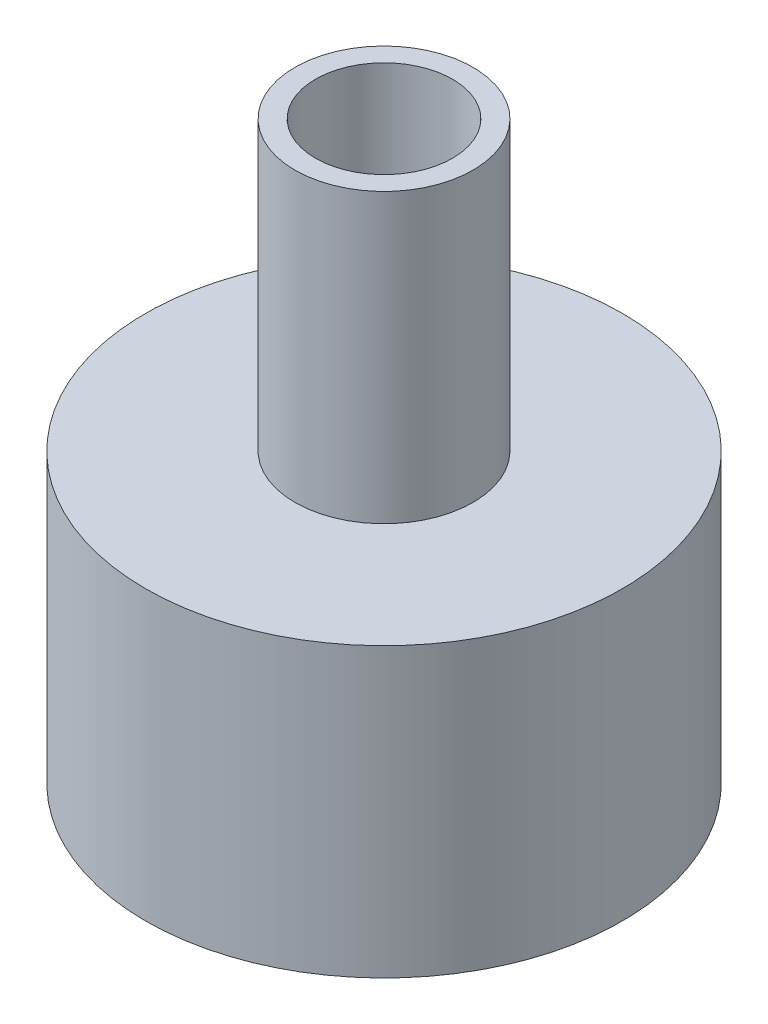
ISO-10303-21;
HEADER;
FILE_DESCRIPTION(('STEP AP214'),'2;1');
FILE_NAME('part.step','',(''),(''),'','','');
FILE_SCHEMA(('AUTOMOTIVE_DESIGN { 1 0 10303 214 1 1 1 1 }'));
ENDSEC;
DATA;
#1=APPLICATION_CONTEXT('core data for automotive mechanical design processes');
#2=APPLICATION_PROTOCOL_DEFINITION('international standard','automotive_design',2000,#1);
#3=PRODUCT_CONTEXT('',#1,'mechanical');
#4=PRODUCT('Part','Part','',(#3));
#5=PRODUCT_RELATED_PRODUCT_CATEGORY('part','',(#4));
#6=PRODUCT_DEFINITION_FORMATION('','',#4);
#7=PRODUCT_DEFINITION_CONTEXT('part definition',#1,'design');
#8=PRODUCT_DEFINITION('design','',#6,#7);
#9=PRODUCT_DEFINITION_SHAPE('','',#8);
#10=(LENGTH_UNIT() NAMED_UNIT(*) SI_UNIT(.MILLI.,.METRE.));
#11=(NAMED_UNIT(*) PLANE_ANGLE_UNIT() SI_UNIT($,.RADIAN.));
#12=(NAMED_UNIT(*) SI_UNIT($,.STERADIAN.) SOLID_ANGLE_UNIT());
#13=UNCERTAINTY_MEASURE_WITH_UNIT(LENGTH_MEASURE(1.E-05),#10,'distance_accuracy_value','');
#14=(GEOMETRIC_REPRESENTATION_CONTEXT(3) GLOBAL_UNCERTAINTY_ASSIGNED_CONTEXT((#13)) GLOBAL_UNIT_ASSIGNED_CONTEXT((#10,
#11,#12)) REPRESENTATION_CONTEXT('',''));
#15=CARTESIAN_POINT('',(0.,0.,0.));
#16=DIRECTION('',(0.,0.,1.));
#17=DIRECTION('',(1.,0.,0.));
#18=AXIS2_PLACEMENT_3D('',#15,#16,#17);
#19=CARTESIAN_POINT('',(0.,2.1,0.));
#20=DIRECTION('',(0.,-1.,0.));
#21=DIRECTION('',(0.,0.,-1.));
#22=AXIS2_PLACEMENT_3D('',#19,#20,#21);
#23=CYLINDRICAL_SURFACE('',#22,1.74);
#24=CARTESIAN_POINT('',(0.,2.1,0.));
#25=DIRECTION('',(0.,1.,0.));
#26=DIRECTION('',(0.,0.,1.));
#27=AXIS2_PLACEMENT_3D('',#24,#25,#26);
#28=CIRCLE('',#27,1.74);
#29=CARTESIAN_POINT('',(0.,2.1,1.74));
#30=VERTEX_POINT('',#29);
#31=EDGE_CURVE('E38',#30,#30,#28,.T.);
#32=ORIENTED_EDGE('',*,*,#31,.F.);
#33=EDGE_LOOP('',(#32));
#34=FACE_BOUND('',#33,.T.);
#35=CARTESIAN_POINT('',(0.,0.,0.));
#36=DIRECTION('',(0.,1.,0.));
#37=DIRECTION('',(0.,0.,1.));
#38=AXIS2_PLACEMENT_3D('',#35,#36,#37);
#39=CIRCLE('',#38,1.74);
#40=CARTESIAN_POINT('',(0.,0.,1.74));
#41=VERTEX_POINT('',#40);
#42=EDGE_CURVE('E34',#41,#41,#39,.T.);
#43=ORIENTED_EDGE('',*,*,#42,.T.);
#44=EDGE_LOOP('',(#43));
#45=FACE_BOUND('',#44,.T.);
#46=ADVANCED_FACE('F31',(#34,#45),#23,.T.);
#47=CARTESIAN_POINT('',(0.,2.1,0.));
#48=DIRECTION('',(0.,1.,0.));
#49=DIRECTION('',(0.,0.,1.));
#50=AXIS2_PLACEMENT_3D('',#47,#48,#49);
#51=PLANE('',#50);
#52=CARTESIAN_POINT('',(0.,2.1,0.));
#53=DIRECTION('',(0.,1.,0.));
#54=DIRECTION('',(0.,0.,1.));
#55=AXIS2_PLACEMENT_3D('',#52,#53,#54);
#56=CIRCLE('',#55,0.65);
#57=CARTESIAN_POINT('',(0.,2.1,0.65));
#58=VERTEX_POINT('',#57);
#59=EDGE_CURVE('E10',#58,#58,#56,.T.);
#60=ORIENTED_EDGE('',*,*,#59,.F.);
#61=EDGE_LOOP('',(#60));
#62=FACE_BOUND('',#61,.T.);
#63=ORIENTED_EDGE('',*,*,#31,.T.);
#64=EDGE_LOOP('',(#63));
#65=FACE_BOUND('',#64,.T.);
#66=ADVANCED_FACE('F75',(#62,#65),#51,.T.);
#67=CARTESIAN_POINT('',(0.,0.,0.));
#68=DIRECTION('',(0.,1.,0.));
#69=DIRECTION('',(0.,0.,1.));
#70=AXIS2_PLACEMENT_3D('',#67,#68,#69);
#71=PLANE('',#70);
#72=ORIENTED_EDGE('',*,*,#42,.F.);
#73=EDGE_LOOP('',(#72));
#74=FACE_BOUND('',#73,.T.);
#75=ADVANCED_FACE('F70',(#74),#71,.F.);
#76=CARTESIAN_POINT('',(0.,4.2,0.));
#77=DIRECTION('',(0.,-1.,0.));
#78=DIRECTION('',(0.,0.,-1.));
#79=AXIS2_PLACEMENT_3D('',#76,#77,#78);
#80=CYLINDRICAL_SURFACE('',#79,0.65);
#81=CARTESIAN_POINT('',(0.,4.2,0.));
#82=DIRECTION('',(0.,1.,0.));
#83=DIRECTION('',(0.,0.,1.));
#84=AXIS2_PLACEMENT_3D('',#81,#82,#83);
#85=CIRCLE('',#84,0.65);
#86=CARTESIAN_POINT('',(0.,4.2,0.65));
#87=VERTEX_POINT('',#86);
#88=EDGE_CURVE('E44',#87,#87,#85,.T.);
#89=ORIENTED_EDGE('',*,*,#88,.F.);
#90=EDGE_LOOP('',(#89));
#91=FACE_BOUND('',#90,.T.);
#92=ORIENTED_EDGE('',*,*,#59,.T.);
#93=EDGE_LOOP('',(#92));
#94=FACE_BOUND('',#93,.T.);
#95=ADVANCED_FACE('F65',(#91,#94),#80,.T.);
#96=CARTESIAN_POINT('',(0.,4.2,0.));
#97=DIRECTION('',(0.,1.,0.));
#98=DIRECTION('',(0.,0.,1.));
#99=AXIS2_PLACEMENT_3D('',#96,#97,#98);
#100=PLANE('',#99);
#101=CARTESIAN_POINT('',(0.,4.2,0.));
#102=DIRECTION('',(0.,1.,0.));
#103=DIRECTION('',(0.,0.,1.));
#104=AXIS2_PLACEMENT_3D('',#101,#102,#103);
#105=CIRCLE('',#104,0.5);
#106=CARTESIAN_POINT('',(0.,4.2,0.5));
#107=VERTEX_POINT('',#106);
#108=EDGE_CURVE('E48',#107,#107,#105,.T.);
#109=ORIENTED_EDGE('',*,*,#108,.F.);
#110=EDGE_LOOP('',(#109));
#111=FACE_BOUND('',#110,.T.);
#112=ORIENTED_EDGE('',*,*,#88,.T.);
#113=EDGE_LOOP('',(#112));
#114=FACE_BOUND('',#113,.T.);
#115=ADVANCED_FACE('F59',(#111,#114),#100,.T.);
#116=CARTESIAN_POINT('',(0.,0.35,0.));
#117=DIRECTION('',(0.,1.,0.));
#118=DIRECTION('',(0.,0.,1.));
#119=AXIS2_PLACEMENT_3D('',#116,#117,#118);
#120=CYLINDRICAL_SURFACE('',#119,0.5);
#121=CARTESIAN_POINT('',(0.,0.35,0.));
#122=DIRECTION('',(0.,1.,0.));
#123=DIRECTION('',(0.,0.,1.));
#124=AXIS2_PLACEMENT_3D('',#121,#122,#123);
#125=CIRCLE('',#124,0.5);
#126=CARTESIAN_POINT('',(0.,0.35,0.5));
#127=VERTEX_POINT('',#126);
#128=EDGE_CURVE('E47',#127,#127,#125,.T.);
#129=ORIENTED_EDGE('',*,*,#128,.F.);
#130=EDGE_LOOP('',(#129));
#131=FACE_BOUND('',#130,.T.);
#132=ORIENTED_EDGE('',*,*,#108,.T.);
#133=EDGE_LOOP('',(#132));
#134=FACE_BOUND('',#133,.T.);
#135=ADVANCED_FACE('F56',(#131,#134),#120,.F.);
#136=CARTESIAN_POINT('',(0.,0.35,0.));
#137=DIRECTION('',(0.,1.,0.));
#138=DIRECTION('',(0.,0.,1.));
#139=AXIS2_PLACEMENT_3D('',#136,#137,#138);
#140=PLANE('',#139);
#141=ORIENTED_EDGE('',*,*,#128,.T.);
#142=EDGE_LOOP('',(#141));
#143=FACE_BOUND('',#142,.T.);
#144=ADVANCED_FACE('F54',(#143),#140,.T.);
#145=CLOSED_SHELL('',(#46,#66,#75,#95,#115,#135,#144));
#146=MANIFOLD_SOLID_BREP('B2',#145);
#147=ADVANCED_BREP_SHAPE_REPRESENTATION('',(#18,#146),#14);
#148=SHAPE_DEFINITION_REPRESENTATION(#9,#147);
ENDSEC;
END-ISO-10303-21;
